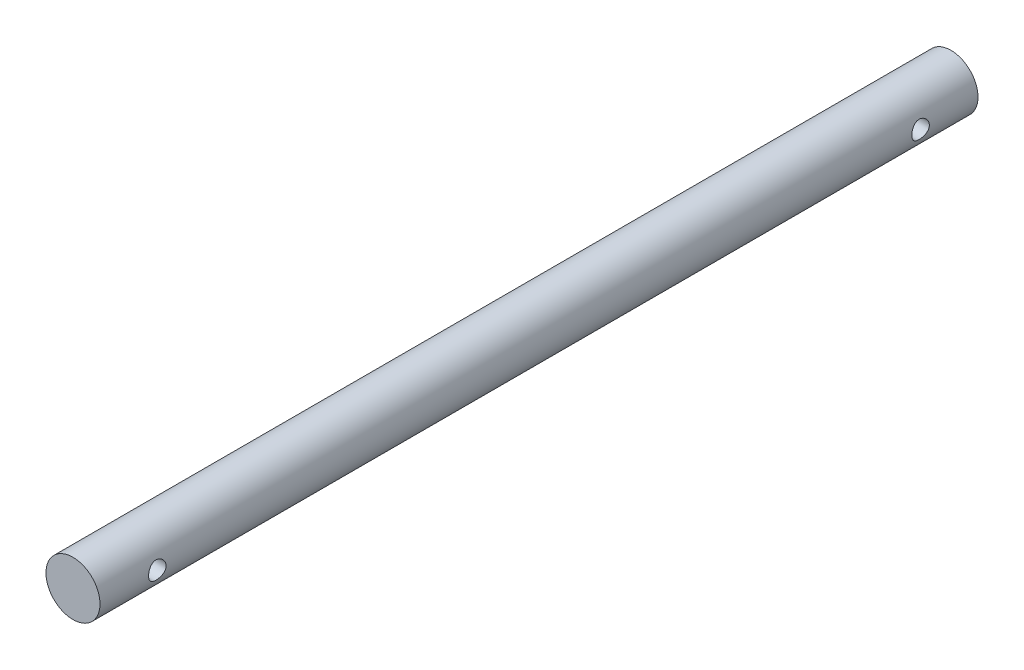
ISO-10303-21;
HEADER;
FILE_DESCRIPTION(('STEP AP214'),'2;1');
FILE_NAME('part.step','',(''),(''),'','','');
FILE_SCHEMA(('AUTOMOTIVE_DESIGN { 1 0 10303 214 1 1 1 1 }'));
ENDSEC;
DATA;
#1=APPLICATION_CONTEXT('core data for automotive mechanical design processes');
#2=APPLICATION_PROTOCOL_DEFINITION('international standard','automotive_design',2000,#1);
#3=PRODUCT_CONTEXT('',#1,'mechanical');
#4=PRODUCT('Part','Part','',(#3));
#5=PRODUCT_RELATED_PRODUCT_CATEGORY('part','',(#4));
#6=PRODUCT_DEFINITION_FORMATION('','',#4);
#7=PRODUCT_DEFINITION_CONTEXT('part definition',#1,'design');
#8=PRODUCT_DEFINITION('design','',#6,#7);
#9=PRODUCT_DEFINITION_SHAPE('','',#8);
#10=(LENGTH_UNIT() NAMED_UNIT(*) SI_UNIT(.MILLI.,.METRE.));
#11=(NAMED_UNIT(*) PLANE_ANGLE_UNIT() SI_UNIT($,.RADIAN.));
#12=(NAMED_UNIT(*) SI_UNIT($,.STERADIAN.) SOLID_ANGLE_UNIT());
#13=UNCERTAINTY_MEASURE_WITH_UNIT(LENGTH_MEASURE(1.E-05),#10,'distance_accuracy_value','');
#14=(GEOMETRIC_REPRESENTATION_CONTEXT(3) GLOBAL_UNCERTAINTY_ASSIGNED_CONTEXT((#13)) GLOBAL_UNIT_ASSIGNED_CONTEXT((#10,
#11,#12)) REPRESENTATION_CONTEXT('',''));
#15=CARTESIAN_POINT('',(0.,0.,0.));
#16=DIRECTION('',(0.,0.,1.));
#17=DIRECTION('',(1.,0.,0.));
#18=AXIS2_PLACEMENT_3D('',#15,#16,#17);
#19=CARTESIAN_POINT('',(0.,0.,65.));
#20=DIRECTION('',(0.,0.,-1.));
#21=DIRECTION('',(-1.,0.,0.));
#22=AXIS2_PLACEMENT_3D('',#19,#20,#21);
#23=CYLINDRICAL_SURFACE('',#22,4.);
#24=CARTESIAN_POINT('',(-4.,0.,-57.8));
#25=CARTESIAN_POINT('',(-3.99999995749826,0.0710317531796134,-57.7999999915574));
#26=CARTESIAN_POINT('',(-3.99809031754443,0.142064319771244,-57.7941592146114));
#27=CARTESIAN_POINT('',(-3.99066007129691,0.282043244902984,-57.7710177333086));
#28=CARTESIAN_POINT('',(-3.98513891199812,0.350989282256519,-57.7537152739045));
#29=CARTESIAN_POINT('',(-3.97108686402745,0.484756730720896,-57.7083019091299));
#30=CARTESIAN_POINT('',(-3.96256085810308,0.549584633114747,-57.6802085319232));
#31=CARTESIAN_POINT('',(-3.94337344575548,0.673609049608407,-57.6140881392865));
#32=CARTESIAN_POINT('',(-3.93271165158622,0.732804538277697,-57.5760593197244));
#33=CARTESIAN_POINT('',(-3.90998372899119,0.845844324592794,-57.489823575483));
#34=CARTESIAN_POINT('',(-3.89788518143411,0.899476148698546,-57.4413467224814));
#35=CARTESIAN_POINT('',(-3.87382947393024,0.998009376364184,-57.3361652135651));
#36=CARTESIAN_POINT('',(-3.8618723435757,1.04290898199248,-57.2794588674161));
#37=CARTESIAN_POINT('',(-3.83910022419606,1.1238912045513,-57.1575451892996));
#38=CARTESIAN_POINT('',(-3.82832495090894,1.15970201778359,-57.0921491800807));
#39=CARTESIAN_POINT('',(-3.80962732329391,1.2197275485592,-56.9558560399167));
#40=CARTESIAN_POINT('',(-3.80170414740975,1.2439456060987,-56.8849605002938));
#41=CARTESIAN_POINT('',(-3.78994824939412,1.27930904388608,-56.7420896013912));
#42=CARTESIAN_POINT('',(-3.78599180890623,1.29085096417072,-56.6702228681426));
#43=CARTESIAN_POINT('',(-3.78225082997438,1.30177383652827,-56.5254724171975));
#44=CARTESIAN_POINT('',(-3.78246507697006,1.30115832900706,-56.4525890017506));
#45=CARTESIAN_POINT('',(-3.78693252569251,1.28809262055215,-56.3112139686567));
#46=CARTESIAN_POINT('',(-3.7910110016715,1.27615436726455,-56.2426685697055));
#47=CARTESIAN_POINT('',(-3.80246229924942,1.24161512958322,-56.1086121064729));
#48=CARTESIAN_POINT('',(-3.80983549711462,1.21901292732086,-56.0431013897039));
#49=CARTESIAN_POINT('',(-3.82717376020854,1.16344161675496,-55.9157878900925));
#50=CARTESIAN_POINT('',(-3.83717725165528,1.13031715471231,-55.8540583766973));
#51=CARTESIAN_POINT('',(-3.85863224992365,1.05474946074364,-55.7368696281308));
#52=CARTESIAN_POINT('',(-3.870084157805,1.01230364537251,-55.6814121377407));
#53=CARTESIAN_POINT('',(-3.89383857895105,0.916817626217515,-55.5754576778682));
#54=CARTESIAN_POINT('',(-3.9061551456587,0.86335719555285,-55.5253418243001));
#55=CARTESIAN_POINT('',(-3.92975388043403,0.748638379559231,-55.4346899735332));
#56=CARTESIAN_POINT('',(-3.94103595880375,0.68737931912799,-55.3941548065725));
#57=CARTESIAN_POINT('',(-3.96143016559477,0.558023985184922,-55.323528167855));
#58=CARTESIAN_POINT('',(-3.97052179542748,0.489871005415787,-55.2935342325606));
#59=CARTESIAN_POINT('',(-3.98536230063387,0.349121400547621,-55.2455529803606));
#60=CARTESIAN_POINT('',(-3.99111227737589,0.27652624826376,-55.2275617072335));
#61=CARTESIAN_POINT('',(-3.99844127975227,0.132182918271081,-55.2047610758344));
#62=CARTESIAN_POINT('',(-4.00018327673697,0.0605243096610287,-55.1994363504567));
#63=CARTESIAN_POINT('',(-3.99978606047933,-0.0826739014571985,-55.2006579981489));
#64=CARTESIAN_POINT('',(-3.9976474660515,-0.154213521119022,-55.2072024785082));
#65=CARTESIAN_POINT('',(-3.98983676355579,-0.293110805971635,-55.2315664501654));
#66=CARTESIAN_POINT('',(-3.98426262217605,-0.360529313749148,-55.2490735496473));
#67=CARTESIAN_POINT('',(-3.97024137257806,-0.49144850227701,-55.2944790559484));
#68=CARTESIAN_POINT('',(-3.96179390197973,-0.554948687660263,-55.3223787735118));
#69=CARTESIAN_POINT('',(-3.94261947612255,-0.678036221921956,-55.3885709080938));
#70=CARTESIAN_POINT('',(-3.93183977717441,-0.737482077392622,-55.42711072995));
#71=CARTESIAN_POINT('',(-3.90922753070674,-0.849232602923503,-55.5131959615893));
#72=CARTESIAN_POINT('',(-3.89739467651042,-0.901535181563672,-55.5607439991268));
#73=CARTESIAN_POINT('',(-3.87336557807198,-0.999856389034448,-55.6659203912177));
#74=CARTESIAN_POINT('',(-3.86117563223107,-1.04550735590287,-55.723894696495));
#75=CARTESIAN_POINT('',(-3.83833739688013,-1.12647310324813,-55.8469444010621));
#76=CARTESIAN_POINT('',(-3.82768910353419,-1.16178790944342,-55.9120197826824));
#77=CARTESIAN_POINT('',(-3.8092505069153,-1.22088986143038,-56.0473810157582));
#78=CARTESIAN_POINT('',(-3.80145207641862,-1.24470985134209,-56.1176513521852));
#79=CARTESIAN_POINT('',(-3.78968975260594,-1.28008038267551,-56.261515112629));
#80=CARTESIAN_POINT('',(-3.78572424334592,-1.29163609486851,-56.3351071225327));
#81=CARTESIAN_POINT('',(-3.78225434748287,-1.30175941935977,-56.4796560469772));
#82=CARTESIAN_POINT('',(-3.78254135999566,-1.3009343264965,-56.550565917239));
#83=CARTESIAN_POINT('',(-3.78703206665166,-1.28780245786658,-56.6911815984667));
#84=CARTESIAN_POINT('',(-3.79123554904181,-1.27549630285018,-56.7608874743219));
#85=CARTESIAN_POINT('',(-3.80293404765169,-1.24017228292054,-56.8959328422913));
#86=CARTESIAN_POINT('',(-3.8103713796557,-1.21734173710049,-56.9613267147114));
#87=CARTESIAN_POINT('',(-3.82768086764088,-1.16176689198724,-57.0874068701794));
#88=CARTESIAN_POINT('',(-3.83755354649392,-1.12902046339815,-57.1480921386015));
#89=CARTESIAN_POINT('',(-3.85913635454559,-1.05294351879197,-57.2657824733854));
#90=CARTESIAN_POINT('',(-3.87090607008722,-1.00922756451649,-57.3225274085499));
#91=CARTESIAN_POINT('',(-3.89469754820139,-0.913114871600302,-57.4280723627933));
#92=CARTESIAN_POINT('',(-3.90671937963017,-0.860715733771488,-57.4768701786514));
#93=CARTESIAN_POINT('',(-3.93018500837504,-0.74643501926979,-57.5669187192873));
#94=CARTESIAN_POINT('',(-3.94159191016833,-0.684277994970702,-57.6078306352571));
#95=CARTESIAN_POINT('',(-3.96205639312843,-0.553600636038902,-57.6785762614709));
#96=CARTESIAN_POINT('',(-3.971114708701,-0.485082299719981,-57.7084134360625));
#97=CARTESIAN_POINT('',(-3.98539862047601,-0.347932952278429,-57.7545332143962));
#98=CARTESIAN_POINT('',(-3.99082412302041,-0.279563201389541,-57.7715309556802));
#99=CARTESIAN_POINT('',(-3.99812440031188,-0.140795566975075,-57.794262977429));
#100=CARTESIAN_POINT('',(-4.00000004212264,-0.0703981829706459,-57.8000000083673));
#101=CARTESIAN_POINT('',(-4.,0.,-57.8));
#102=B_SPLINE_CURVE_WITH_KNOTS('',3,(#24,#25,#26,#27,#28,#29,#30,#31,#32,#33,#34,#35,#36,#37,
#38,#39,#40,#41,#42,#43,#44,#45,#46,#47,#48,#49,#50,#51,#52,#53,#54,#55,#56,#57,#58,#59,#60,#61,
#62,#63,#64,#65,#66,#67,#68,#69,#70,#71,#72,#73,#74,#75,#76,#77,#78,#79,#80,#81,#82,#83,#84,#85,
#86,#87,#88,#89,#90,#91,#92,#93,#94,#95,#96,#97,#98,#99,#100,#101),.UNSPECIFIED.,.T.,.F.,(4,2,2,
2,2,2,2,2,2,2,2,2,2,2,2,2,2,2,2,2,2,2,2,2,2,2,2,2,2,2,2,2,2,2,2,2,2,2,4),(0.,0.212836320501871,
0.425705238678368,0.638229836796225,0.850793053150726,1.06970118523821,1.28865434209611,
1.51353896111274,1.73835874942418,1.95592547275084,2.17342883866662,2.38154447169366,
2.58968387817212,2.80105153146273,3.01247784012411,3.23436338576862,3.45626815240874,
3.68017522233036,3.90400845328364,4.11856594913053,4.33308923379461,4.54176144591878,
4.75045998524196,4.96449273597468,5.17858801783488,5.40190417826791,5.62521978304092,
5.84789347385934,6.0704732453528,6.28217245322978,6.49386021576158,6.7019176519715,
6.9100197973008,7.12682695905995,7.34369412543826,7.56844430375461,7.79312411742493,
8.00411357835247,8.21505149784324),.UNSPECIFIED.);
#103=CARTESIAN_POINT('',(-4.,0.,-57.8));
#104=VERTEX_POINT('',#103);
#105=EDGE_CURVE('E62',#104,#104,#102,.T.);
#106=ORIENTED_EDGE('',*,*,#105,.T.);
#107=EDGE_LOOP('',(#106));
#108=FACE_BOUND('',#107,.T.);
#109=CARTESIAN_POINT('',(4.,0.,-57.8));
#110=CARTESIAN_POINT('',(3.99999995749826,-0.0710317531796134,-57.7999999915574));
#111=CARTESIAN_POINT('',(3.99809031754443,-0.142064319771244,-57.7941592146114));
#112=CARTESIAN_POINT('',(3.99066007129691,-0.282043244902984,-57.7710177333086));
#113=CARTESIAN_POINT('',(3.98513891199812,-0.350989282256519,-57.7537152739045));
#114=CARTESIAN_POINT('',(3.97108686402745,-0.484756730720896,-57.7083019091299));
#115=CARTESIAN_POINT('',(3.96256085810308,-0.549584633114747,-57.6802085319232));
#116=CARTESIAN_POINT('',(3.94337344575548,-0.673609049608407,-57.6140881392865));
#117=CARTESIAN_POINT('',(3.93271165158622,-0.732804538277697,-57.5760593197244));
#118=CARTESIAN_POINT('',(3.90998372899119,-0.845844324592794,-57.489823575483));
#119=CARTESIAN_POINT('',(3.89788518143411,-0.899476148698546,-57.4413467224814));
#120=CARTESIAN_POINT('',(3.87382947393024,-0.998009376364184,-57.3361652135651));
#121=CARTESIAN_POINT('',(3.8618723435757,-1.04290898199248,-57.2794588674161));
#122=CARTESIAN_POINT('',(3.83910022419606,-1.1238912045513,-57.1575451892996));
#123=CARTESIAN_POINT('',(3.82832495090894,-1.15970201778359,-57.0921491800807));
#124=CARTESIAN_POINT('',(3.80962732329391,-1.2197275485592,-56.9558560399167));
#125=CARTESIAN_POINT('',(3.80170414740975,-1.2439456060987,-56.8849605002938));
#126=CARTESIAN_POINT('',(3.78994824939412,-1.27930904388608,-56.7420896013912));
#127=CARTESIAN_POINT('',(3.78599180890623,-1.29085096417072,-56.6702228681426));
#128=CARTESIAN_POINT('',(3.78225082997438,-1.30177383652827,-56.5254724171975));
#129=CARTESIAN_POINT('',(3.78246507697006,-1.30115832900706,-56.4525890017506));
#130=CARTESIAN_POINT('',(3.78693252569251,-1.28809262055215,-56.3112139686567));
#131=CARTESIAN_POINT('',(3.7910110016715,-1.27615436726455,-56.2426685697055));
#132=CARTESIAN_POINT('',(3.80246229924942,-1.24161512958322,-56.1086121064729));
#133=CARTESIAN_POINT('',(3.80983549711462,-1.21901292732086,-56.0431013897039));
#134=CARTESIAN_POINT('',(3.82717376020854,-1.16344161675496,-55.9157878900925));
#135=CARTESIAN_POINT('',(3.83717725165528,-1.13031715471231,-55.8540583766973));
#136=CARTESIAN_POINT('',(3.85863224992365,-1.05474946074364,-55.7368696281308));
#137=CARTESIAN_POINT('',(3.870084157805,-1.01230364537251,-55.6814121377407));
#138=CARTESIAN_POINT('',(3.89383857895105,-0.916817626217515,-55.5754576778682));
#139=CARTESIAN_POINT('',(3.9061551456587,-0.86335719555285,-55.5253418243001));
#140=CARTESIAN_POINT('',(3.92975388043403,-0.748638379559231,-55.4346899735332));
#141=CARTESIAN_POINT('',(3.94103595880375,-0.68737931912799,-55.3941548065725));
#142=CARTESIAN_POINT('',(3.96143016559477,-0.558023985184922,-55.323528167855));
#143=CARTESIAN_POINT('',(3.97052179542748,-0.489871005415787,-55.2935342325606));
#144=CARTESIAN_POINT('',(3.98536230063387,-0.349121400547621,-55.2455529803606));
#145=CARTESIAN_POINT('',(3.99111227737589,-0.27652624826376,-55.2275617072335));
#146=CARTESIAN_POINT('',(3.99844127975227,-0.132182918271081,-55.2047610758344));
#147=CARTESIAN_POINT('',(4.00018327673697,-0.0605243096610287,-55.1994363504567));
#148=CARTESIAN_POINT('',(3.99978606047933,0.0826739014571985,-55.2006579981489));
#149=CARTESIAN_POINT('',(3.9976474660515,0.154213521119022,-55.2072024785082));
#150=CARTESIAN_POINT('',(3.98983676355579,0.293110805971635,-55.2315664501654));
#151=CARTESIAN_POINT('',(3.98426262217605,0.360529313749148,-55.2490735496473));
#152=CARTESIAN_POINT('',(3.97024137257806,0.49144850227701,-55.2944790559484));
#153=CARTESIAN_POINT('',(3.96179390197973,0.554948687660263,-55.3223787735118));
#154=CARTESIAN_POINT('',(3.94261947612255,0.678036221921956,-55.3885709080938));
#155=CARTESIAN_POINT('',(3.93183977717441,0.737482077392622,-55.42711072995));
#156=CARTESIAN_POINT('',(3.90922753070674,0.849232602923503,-55.5131959615893));
#157=CARTESIAN_POINT('',(3.89739467651042,0.901535181563672,-55.5607439991268));
#158=CARTESIAN_POINT('',(3.87336557807198,0.999856389034448,-55.6659203912177));
#159=CARTESIAN_POINT('',(3.86117563223107,1.04550735590287,-55.723894696495));
#160=CARTESIAN_POINT('',(3.83833739688013,1.12647310324813,-55.8469444010621));
#161=CARTESIAN_POINT('',(3.82768910353419,1.16178790944342,-55.9120197826824));
#162=CARTESIAN_POINT('',(3.8092505069153,1.22088986143038,-56.0473810157582));
#163=CARTESIAN_POINT('',(3.80145207641862,1.24470985134209,-56.1176513521852));
#164=CARTESIAN_POINT('',(3.78968975260594,1.28008038267551,-56.261515112629));
#165=CARTESIAN_POINT('',(3.78572424334592,1.29163609486851,-56.3351071225327));
#166=CARTESIAN_POINT('',(3.78225434748287,1.30175941935977,-56.4796560469772));
#167=CARTESIAN_POINT('',(3.78254135999566,1.3009343264965,-56.550565917239));
#168=CARTESIAN_POINT('',(3.78703206665166,1.28780245786658,-56.6911815984667));
#169=CARTESIAN_POINT('',(3.79123554904181,1.27549630285018,-56.7608874743219));
#170=CARTESIAN_POINT('',(3.80293404765169,1.24017228292054,-56.8959328422913));
#171=CARTESIAN_POINT('',(3.8103713796557,1.21734173710049,-56.9613267147114));
#172=CARTESIAN_POINT('',(3.82768086764088,1.16176689198724,-57.0874068701794));
#173=CARTESIAN_POINT('',(3.83755354649392,1.12902046339815,-57.1480921386015));
#174=CARTESIAN_POINT('',(3.85913635454559,1.05294351879197,-57.2657824733854));
#175=CARTESIAN_POINT('',(3.87090607008722,1.00922756451649,-57.3225274085499));
#176=CARTESIAN_POINT('',(3.89469754820139,0.913114871600302,-57.4280723627933));
#177=CARTESIAN_POINT('',(3.90671937963017,0.860715733771488,-57.4768701786514));
#178=CARTESIAN_POINT('',(3.93018500837504,0.74643501926979,-57.5669187192873));
#179=CARTESIAN_POINT('',(3.94159191016833,0.684277994970702,-57.6078306352571));
#180=CARTESIAN_POINT('',(3.96205639312843,0.553600636038902,-57.6785762614709));
#181=CARTESIAN_POINT('',(3.971114708701,0.485082299719981,-57.7084134360625));
#182=CARTESIAN_POINT('',(3.98539862047601,0.347932952278429,-57.7545332143962));
#183=CARTESIAN_POINT('',(3.99082412302041,0.279563201389541,-57.7715309556802));
#184=CARTESIAN_POINT('',(3.99812440031188,0.140795566975075,-57.794262977429));
#185=CARTESIAN_POINT('',(4.00000004212264,0.0703981829706459,-57.8000000083673));
#186=CARTESIAN_POINT('',(4.,0.,-57.8));
#187=B_SPLINE_CURVE_WITH_KNOTS('',3,(#109,#110,#111,#112,#113,#114,#115,#116,#117,#118,#119,
#120,#121,#122,#123,#124,#125,#126,#127,#128,#129,#130,#131,#132,#133,#134,#135,#136,#137,#138,
#139,#140,#141,#142,#143,#144,#145,#146,#147,#148,#149,#150,#151,#152,#153,#154,#155,#156,#157,
#158,#159,#160,#161,#162,#163,#164,#165,#166,#167,#168,#169,#170,#171,#172,#173,#174,#175,#176,
#177,#178,#179,#180,#181,#182,#183,#184,#185,#186),.UNSPECIFIED.,.T.,.F.,(4,2,2,2,2,2,2,2,2,2,2,
2,2,2,2,2,2,2,2,2,2,2,2,2,2,2,2,2,2,2,2,2,2,2,2,2,2,2,4),(0.,0.212836320501871,
0.425705238678368,0.638229836796225,0.850793053150726,1.06970118523821,1.28865434209611,
1.51353896111274,1.73835874942418,1.95592547275084,2.17342883866662,2.38154447169366,
2.58968387817212,2.80105153146273,3.01247784012411,3.23436338576862,3.45626815240874,
3.68017522233036,3.90400845328364,4.11856594913053,4.33308923379461,4.54176144591878,
4.75045998524196,4.96449273597468,5.17858801783488,5.40190417826791,5.62521978304092,
5.84789347385934,6.0704732453528,6.28217245322978,6.49386021576158,6.7019176519715,
6.9100197973008,7.12682695905995,7.34369412543826,7.56844430375461,7.79312411742493,
8.00411357835247,8.21505149784324),.UNSPECIFIED.);
#188=CARTESIAN_POINT('',(4.,0.,-57.8));
#189=VERTEX_POINT('',#188);
#190=EDGE_CURVE('E67',#189,#189,#187,.T.);
#191=ORIENTED_EDGE('',*,*,#190,.T.);
#192=EDGE_LOOP('',(#191));
#193=FACE_BOUND('',#192,.T.);
#194=CARTESIAN_POINT('',(0.,0.,65.));
#195=DIRECTION('',(0.,0.,1.));
#196=DIRECTION('',(1.,0.,0.));
#197=AXIS2_PLACEMENT_3D('',#194,#195,#196);
#198=CIRCLE('',#197,4.);
#199=CARTESIAN_POINT('',(4.,0.,65.));
#200=VERTEX_POINT('',#199);
#201=EDGE_CURVE('E95',#200,#200,#198,.T.);
#202=ORIENTED_EDGE('',*,*,#201,.F.);
#203=EDGE_LOOP('',(#202));
#204=FACE_BOUND('',#203,.T.);
#205=CARTESIAN_POINT('',(0.,0.,-65.));
#206=DIRECTION('',(0.,0.,1.));
#207=DIRECTION('',(1.,0.,0.));
#208=AXIS2_PLACEMENT_3D('',#205,#206,#207);
#209=CIRCLE('',#208,4.);
#210=CARTESIAN_POINT('',(4.,0.,-65.));
#211=VERTEX_POINT('',#210);
#212=EDGE_CURVE('E96',#211,#211,#209,.T.);
#213=ORIENTED_EDGE('',*,*,#212,.T.);
#214=EDGE_LOOP('',(#213));
#215=FACE_BOUND('',#214,.T.);
#216=CARTESIAN_POINT('',(4.,0.,55.2));
#217=CARTESIAN_POINT('',(3.99999995749826,0.0710317531796133,55.2000000084426));
#218=CARTESIAN_POINT('',(3.99809031754443,0.142064319771243,55.2058407853886));
#219=CARTESIAN_POINT('',(3.99066007129691,0.282043244902984,55.2289822666914));
#220=CARTESIAN_POINT('',(3.98513891199812,0.350989282256519,55.2462847260955));
#221=CARTESIAN_POINT('',(3.97108686402745,0.484756730720893,55.2916980908701));
#222=CARTESIAN_POINT('',(3.96256085810308,0.549584633114741,55.3197914680768));
#223=CARTESIAN_POINT('',(3.94337344575548,0.673609049608401,55.3859118607135));
#224=CARTESIAN_POINT('',(3.93271165158623,0.732804538277695,55.4239406802756));
#225=CARTESIAN_POINT('',(3.90998372899119,0.845844324592795,55.510176424517));
#226=CARTESIAN_POINT('',(3.89788518143411,0.899476148698546,55.5586532775186));
#227=CARTESIAN_POINT('',(3.87382947393024,0.998009376364184,55.6638347864349));
#228=CARTESIAN_POINT('',(3.8618723435757,1.04290898199248,55.7205411325839));
#229=CARTESIAN_POINT('',(3.83910022419606,1.1238912045513,55.8424548107004));
#230=CARTESIAN_POINT('',(3.82832495090894,1.15970201778359,55.9078508199193));
#231=CARTESIAN_POINT('',(3.80962732329391,1.2197275485592,56.0441439600833));
#232=CARTESIAN_POINT('',(3.80170414740975,1.2439456060987,56.1150394997062));
#233=CARTESIAN_POINT('',(3.78994824939412,1.27930904388608,56.2579103986088));
#234=CARTESIAN_POINT('',(3.78599180890623,1.29085096417072,56.3297771318573));
#235=CARTESIAN_POINT('',(3.78225082997438,1.30177383652827,56.4745275828025));
#236=CARTESIAN_POINT('',(3.78246507697006,1.30115832900706,56.5474109982494));
#237=CARTESIAN_POINT('',(3.78693252569251,1.28809262055215,56.6887860313433));
#238=CARTESIAN_POINT('',(3.7910110016715,1.27615436726456,56.7573314302945));
#239=CARTESIAN_POINT('',(3.80246229924942,1.24161512958323,56.8913878935271));
#240=CARTESIAN_POINT('',(3.80983549711462,1.21901292732087,56.9568986102961));
#241=CARTESIAN_POINT('',(3.82717376020853,1.16344161675496,57.0842121099075));
#242=CARTESIAN_POINT('',(3.83717725165528,1.13031715471231,57.1459416233027));
#243=CARTESIAN_POINT('',(3.85863224992365,1.05474946074364,57.2631303718691));
#244=CARTESIAN_POINT('',(3.870084157805,1.01230364537251,57.3185878622593));
#245=CARTESIAN_POINT('',(3.89383857895105,0.916817626217515,57.4245423221318));
#246=CARTESIAN_POINT('',(3.9061551456587,0.86335719555285,57.4746581756999));
#247=CARTESIAN_POINT('',(3.92975388043403,0.748638379559231,57.5653100264668));
#248=CARTESIAN_POINT('',(3.94103595880375,0.687379319127989,57.6058451934275));
#249=CARTESIAN_POINT('',(3.96143016559477,0.558023985184922,57.676471832145));
#250=CARTESIAN_POINT('',(3.97052179542748,0.489871005415787,57.7064657674394));
#251=CARTESIAN_POINT('',(3.98536230063387,0.349121400547621,57.7544470196394));
#252=CARTESIAN_POINT('',(3.99111227737589,0.27652624826376,57.7724382927666));
#253=CARTESIAN_POINT('',(3.99844127975227,0.132182918271081,57.7952389241656));
#254=CARTESIAN_POINT('',(4.00018327673697,0.0605243096610287,57.8005636495433));
#255=CARTESIAN_POINT('',(3.99978606047933,-0.0826739014571985,57.7993420018511));
#256=CARTESIAN_POINT('',(3.9976474660515,-0.154213521119022,57.7927975214918));
#257=CARTESIAN_POINT('',(3.98983676355579,-0.293110805971635,57.7684335498346));
#258=CARTESIAN_POINT('',(3.98426262217605,-0.360529313749148,57.7509264503527));
#259=CARTESIAN_POINT('',(3.97024137257806,-0.49144850227701,57.7055209440516));
#260=CARTESIAN_POINT('',(3.96179390197973,-0.554948687660263,57.6776212264882));
#261=CARTESIAN_POINT('',(3.94261947612255,-0.678036221921956,57.6114290919062));
#262=CARTESIAN_POINT('',(3.93183977717441,-0.737482077392622,57.57288927005));
#263=CARTESIAN_POINT('',(3.90922753070674,-0.849232602923503,57.4868040384107));
#264=CARTESIAN_POINT('',(3.89739467651042,-0.901535181563672,57.4392560008732));
#265=CARTESIAN_POINT('',(3.87336557807198,-0.999856389034449,57.3340796087823));
#266=CARTESIAN_POINT('',(3.86117563223107,-1.04550735590287,57.276105303505));
#267=CARTESIAN_POINT('',(3.83833739688013,-1.12647310324813,57.1530555989379));
#268=CARTESIAN_POINT('',(3.82768910353419,-1.16178790944342,57.0879802173176));
#269=CARTESIAN_POINT('',(3.8092505069153,-1.22088986143038,56.9526189842418));
#270=CARTESIAN_POINT('',(3.80145207641862,-1.24470985134209,56.8823486478148));
#271=CARTESIAN_POINT('',(3.78968975260594,-1.28008038267551,56.738484887371));
#272=CARTESIAN_POINT('',(3.78572424334592,-1.29163609486851,56.6648928774673));
#273=CARTESIAN_POINT('',(3.78225434748287,-1.30175941935977,56.5203439530228));
#274=CARTESIAN_POINT('',(3.78254135999566,-1.3009343264965,56.449434082761));
#275=CARTESIAN_POINT('',(3.78703206665166,-1.28780245786658,56.3088184015333));
#276=CARTESIAN_POINT('',(3.79123554904181,-1.27549630285018,56.2391125256781));
#277=CARTESIAN_POINT('',(3.80293404765169,-1.24017228292054,56.1040671577087));
#278=CARTESIAN_POINT('',(3.8103713796557,-1.21734173710049,56.0386732852886));
#279=CARTESIAN_POINT('',(3.82768086764088,-1.16176689198724,55.9125931298206));
#280=CARTESIAN_POINT('',(3.83755354649392,-1.12902046339815,55.8519078613985));
#281=CARTESIAN_POINT('',(3.85913635454559,-1.05294351879197,55.7342175266146));
#282=CARTESIAN_POINT('',(3.87090607008722,-1.00922756451649,55.6774725914501));
#283=CARTESIAN_POINT('',(3.89469754820139,-0.913114871600302,55.5719276372067));
#284=CARTESIAN_POINT('',(3.90671937963017,-0.860715733771488,55.5231298213486));
#285=CARTESIAN_POINT('',(3.93018500837504,-0.74643501926979,55.4330812807127));
#286=CARTESIAN_POINT('',(3.94159191016833,-0.684277994970702,55.3921693647429));
#287=CARTESIAN_POINT('',(3.96205639312843,-0.553600636038902,55.3214237385291));
#288=CARTESIAN_POINT('',(3.971114708701,-0.485082299719981,55.2915865639375));
#289=CARTESIAN_POINT('',(3.98539862047601,-0.347932952278429,55.2454667856038));
#290=CARTESIAN_POINT('',(3.99082412302041,-0.279563201389541,55.2284690443198));
#291=CARTESIAN_POINT('',(3.99812440031188,-0.140795566975075,55.205737022571));
#292=CARTESIAN_POINT('',(4.00000004212264,-0.0703981829706459,55.1999999916327));
#293=CARTESIAN_POINT('',(4.,0.,55.2));
#294=B_SPLINE_CURVE_WITH_KNOTS('',3,(#216,#217,#218,#219,#220,#221,#222,#223,#224,#225,#226,
#227,#228,#229,#230,#231,#232,#233,#234,#235,#236,#237,#238,#239,#240,#241,#242,#243,#244,#245,
#246,#247,#248,#249,#250,#251,#252,#253,#254,#255,#256,#257,#258,#259,#260,#261,#262,#263,#264,
#265,#266,#267,#268,#269,#270,#271,#272,#273,#274,#275,#276,#277,#278,#279,#280,#281,#282,#283,
#284,#285,#286,#287,#288,#289,#290,#291,#292,#293),.UNSPECIFIED.,.T.,.F.,(4,2,2,2,2,2,2,2,2,2,2,
2,2,2,2,2,2,2,2,2,2,2,2,2,2,2,2,2,2,2,2,2,2,2,2,2,2,2,4),(0.,0.212836320501871,
0.425705238678368,0.638229836796217,0.850793053150725,1.06970118523821,1.28865434209611,
1.51353896111274,1.73835874942418,1.95592547275083,2.17342883866662,2.38154447169364,
2.58968387817212,2.80105153146272,3.01247784012411,3.23436338576861,3.45626815240874,
3.68017522233036,3.90400845328364,4.11856594913053,4.33308923379461,4.54176144591877,
4.75045998524196,4.96449273597468,5.17858801783488,5.40190417826792,5.62521978304092,
5.84789347385933,6.0704732453528,6.28217245322977,6.49386021576158,6.70191765197149,
6.9100197973008,7.12682695905995,7.34369412543825,7.5684443037546,7.79312411742493,
8.00411357835247,8.21505149784324),.UNSPECIFIED.);
#295=CARTESIAN_POINT('',(4.,0.,55.2));
#296=VERTEX_POINT('',#295);
#297=EDGE_CURVE('E57',#296,#296,#294,.T.);
#298=ORIENTED_EDGE('',*,*,#297,.F.);
#299=EDGE_LOOP('',(#298));
#300=FACE_BOUND('',#299,.T.);
#301=CARTESIAN_POINT('',(-4.,0.,55.2));
#302=CARTESIAN_POINT('',(-3.99999995749826,-0.0710317531796133,55.2000000084426));
#303=CARTESIAN_POINT('',(-3.99809031754443,-0.142064319771243,55.2058407853886));
#304=CARTESIAN_POINT('',(-3.99066007129691,-0.282043244902984,55.2289822666914));
#305=CARTESIAN_POINT('',(-3.98513891199812,-0.350989282256519,55.2462847260955));
#306=CARTESIAN_POINT('',(-3.97108686402745,-0.484756730720893,55.2916980908701));
#307=CARTESIAN_POINT('',(-3.96256085810308,-0.549584633114741,55.3197914680768));
#308=CARTESIAN_POINT('',(-3.94337344575548,-0.673609049608401,55.3859118607135));
#309=CARTESIAN_POINT('',(-3.93271165158623,-0.732804538277695,55.4239406802756));
#310=CARTESIAN_POINT('',(-3.90998372899119,-0.845844324592795,55.510176424517));
#311=CARTESIAN_POINT('',(-3.89788518143411,-0.899476148698546,55.5586532775186));
#312=CARTESIAN_POINT('',(-3.87382947393024,-0.998009376364184,55.6638347864349));
#313=CARTESIAN_POINT('',(-3.8618723435757,-1.04290898199248,55.7205411325839));
#314=CARTESIAN_POINT('',(-3.83910022419606,-1.1238912045513,55.8424548107004));
#315=CARTESIAN_POINT('',(-3.82832495090894,-1.15970201778359,55.9078508199193));
#316=CARTESIAN_POINT('',(-3.80962732329391,-1.2197275485592,56.0441439600833));
#317=CARTESIAN_POINT('',(-3.80170414740975,-1.2439456060987,56.1150394997062));
#318=CARTESIAN_POINT('',(-3.78994824939412,-1.27930904388608,56.2579103986088));
#319=CARTESIAN_POINT('',(-3.78599180890623,-1.29085096417072,56.3297771318573));
#320=CARTESIAN_POINT('',(-3.78225082997438,-1.30177383652827,56.4745275828025));
#321=CARTESIAN_POINT('',(-3.78246507697006,-1.30115832900706,56.5474109982494));
#322=CARTESIAN_POINT('',(-3.78693252569251,-1.28809262055215,56.6887860313433));
#323=CARTESIAN_POINT('',(-3.7910110016715,-1.27615436726456,56.7573314302945));
#324=CARTESIAN_POINT('',(-3.80246229924942,-1.24161512958323,56.8913878935271));
#325=CARTESIAN_POINT('',(-3.80983549711462,-1.21901292732087,56.9568986102961));
#326=CARTESIAN_POINT('',(-3.82717376020853,-1.16344161675496,57.0842121099075));
#327=CARTESIAN_POINT('',(-3.83717725165528,-1.13031715471231,57.1459416233027));
#328=CARTESIAN_POINT('',(-3.85863224992365,-1.05474946074364,57.2631303718691));
#329=CARTESIAN_POINT('',(-3.870084157805,-1.01230364537251,57.3185878622593));
#330=CARTESIAN_POINT('',(-3.89383857895105,-0.916817626217515,57.4245423221318));
#331=CARTESIAN_POINT('',(-3.9061551456587,-0.86335719555285,57.4746581756999));
#332=CARTESIAN_POINT('',(-3.92975388043403,-0.748638379559231,57.5653100264668));
#333=CARTESIAN_POINT('',(-3.94103595880375,-0.687379319127989,57.6058451934275));
#334=CARTESIAN_POINT('',(-3.96143016559477,-0.558023985184922,57.676471832145));
#335=CARTESIAN_POINT('',(-3.97052179542748,-0.489871005415787,57.7064657674394));
#336=CARTESIAN_POINT('',(-3.98536230063387,-0.349121400547621,57.7544470196394));
#337=CARTESIAN_POINT('',(-3.99111227737589,-0.27652624826376,57.7724382927666));
#338=CARTESIAN_POINT('',(-3.99844127975227,-0.132182918271081,57.7952389241656));
#339=CARTESIAN_POINT('',(-4.00018327673697,-0.0605243096610287,57.8005636495433));
#340=CARTESIAN_POINT('',(-3.99978606047933,0.0826739014571985,57.7993420018511));
#341=CARTESIAN_POINT('',(-3.9976474660515,0.154213521119022,57.7927975214918));
#342=CARTESIAN_POINT('',(-3.98983676355579,0.293110805971635,57.7684335498346));
#343=CARTESIAN_POINT('',(-3.98426262217605,0.360529313749148,57.7509264503527));
#344=CARTESIAN_POINT('',(-3.97024137257806,0.49144850227701,57.7055209440516));
#345=CARTESIAN_POINT('',(-3.96179390197973,0.554948687660263,57.6776212264882));
#346=CARTESIAN_POINT('',(-3.94261947612255,0.678036221921956,57.6114290919062));
#347=CARTESIAN_POINT('',(-3.93183977717441,0.737482077392622,57.57288927005));
#348=CARTESIAN_POINT('',(-3.90922753070674,0.849232602923503,57.4868040384107));
#349=CARTESIAN_POINT('',(-3.89739467651042,0.901535181563672,57.4392560008732));
#350=CARTESIAN_POINT('',(-3.87336557807198,0.999856389034449,57.3340796087823));
#351=CARTESIAN_POINT('',(-3.86117563223107,1.04550735590287,57.276105303505));
#352=CARTESIAN_POINT('',(-3.83833739688013,1.12647310324813,57.1530555989379));
#353=CARTESIAN_POINT('',(-3.82768910353419,1.16178790944342,57.0879802173176));
#354=CARTESIAN_POINT('',(-3.8092505069153,1.22088986143038,56.9526189842418));
#355=CARTESIAN_POINT('',(-3.80145207641862,1.24470985134209,56.8823486478148));
#356=CARTESIAN_POINT('',(-3.78968975260594,1.28008038267551,56.738484887371));
#357=CARTESIAN_POINT('',(-3.78572424334592,1.29163609486851,56.6648928774673));
#358=CARTESIAN_POINT('',(-3.78225434748287,1.30175941935977,56.5203439530228));
#359=CARTESIAN_POINT('',(-3.78254135999566,1.3009343264965,56.449434082761));
#360=CARTESIAN_POINT('',(-3.78703206665166,1.28780245786658,56.3088184015333));
#361=CARTESIAN_POINT('',(-3.79123554904181,1.27549630285018,56.2391125256781));
#362=CARTESIAN_POINT('',(-3.80293404765169,1.24017228292054,56.1040671577087));
#363=CARTESIAN_POINT('',(-3.8103713796557,1.21734173710049,56.0386732852886));
#364=CARTESIAN_POINT('',(-3.82768086764088,1.16176689198724,55.9125931298206));
#365=CARTESIAN_POINT('',(-3.83755354649392,1.12902046339815,55.8519078613985));
#366=CARTESIAN_POINT('',(-3.85913635454559,1.05294351879197,55.7342175266146));
#367=CARTESIAN_POINT('',(-3.87090607008722,1.00922756451649,55.6774725914501));
#368=CARTESIAN_POINT('',(-3.89469754820139,0.913114871600302,55.5719276372067));
#369=CARTESIAN_POINT('',(-3.90671937963017,0.860715733771488,55.5231298213486));
#370=CARTESIAN_POINT('',(-3.93018500837504,0.74643501926979,55.4330812807127));
#371=CARTESIAN_POINT('',(-3.94159191016833,0.684277994970702,55.3921693647429));
#372=CARTESIAN_POINT('',(-3.96205639312843,0.553600636038902,55.3214237385291));
#373=CARTESIAN_POINT('',(-3.971114708701,0.485082299719981,55.2915865639375));
#374=CARTESIAN_POINT('',(-3.98539862047601,0.347932952278429,55.2454667856038));
#375=CARTESIAN_POINT('',(-3.99082412302041,0.279563201389541,55.2284690443198));
#376=CARTESIAN_POINT('',(-3.99812440031188,0.140795566975075,55.205737022571));
#377=CARTESIAN_POINT('',(-4.00000004212264,0.0703981829706459,55.1999999916327));
#378=CARTESIAN_POINT('',(-4.,0.,55.2));
#379=B_SPLINE_CURVE_WITH_KNOTS('',3,(#301,#302,#303,#304,#305,#306,#307,#308,#309,#310,#311,
#312,#313,#314,#315,#316,#317,#318,#319,#320,#321,#322,#323,#324,#325,#326,#327,#328,#329,#330,
#331,#332,#333,#334,#335,#336,#337,#338,#339,#340,#341,#342,#343,#344,#345,#346,#347,#348,#349,
#350,#351,#352,#353,#354,#355,#356,#357,#358,#359,#360,#361,#362,#363,#364,#365,#366,#367,#368,
#369,#370,#371,#372,#373,#374,#375,#376,#377,#378),.UNSPECIFIED.,.T.,.F.,(4,2,2,2,2,2,2,2,2,2,2,
2,2,2,2,2,2,2,2,2,2,2,2,2,2,2,2,2,2,2,2,2,2,2,2,2,2,2,4),(0.,0.212836320501871,
0.425705238678368,0.638229836796217,0.850793053150725,1.06970118523821,1.28865434209611,
1.51353896111274,1.73835874942418,1.95592547275083,2.17342883866662,2.38154447169364,
2.58968387817212,2.80105153146272,3.01247784012411,3.23436338576861,3.45626815240874,
3.68017522233036,3.90400845328364,4.11856594913053,4.33308923379461,4.54176144591877,
4.75045998524196,4.96449273597468,5.17858801783488,5.40190417826792,5.62521978304092,
5.84789347385933,6.0704732453528,6.28217245322977,6.49386021576158,6.70191765197149,
6.9100197973008,7.12682695905995,7.34369412543825,7.5684443037546,7.79312411742493,
8.00411357835247,8.21505149784324),.UNSPECIFIED.);
#380=CARTESIAN_POINT('',(-4.,0.,55.2));
#381=VERTEX_POINT('',#380);
#382=EDGE_CURVE('E10',#381,#381,#379,.T.);
#383=ORIENTED_EDGE('',*,*,#382,.F.);
#384=EDGE_LOOP('',(#383));
#385=FACE_BOUND('',#384,.T.);
#386=ADVANCED_FACE('F45',(#108,#193,#204,#215,#300,#385),#23,.T.);
#387=CARTESIAN_POINT('',(0.,0.,65.));
#388=DIRECTION('',(0.,0.,1.));
#389=DIRECTION('',(1.,0.,0.));
#390=AXIS2_PLACEMENT_3D('',#387,#388,#389);
#391=PLANE('',#390);
#392=ORIENTED_EDGE('',*,*,#201,.T.);
#393=EDGE_LOOP('',(#392));
#394=FACE_BOUND('',#393,.T.);
#395=ADVANCED_FACE('F87',(#394),#391,.T.);
#396=CARTESIAN_POINT('',(0.,0.,-65.));
#397=DIRECTION('',(0.,0.,1.));
#398=DIRECTION('',(1.,0.,0.));
#399=AXIS2_PLACEMENT_3D('',#396,#397,#398);
#400=PLANE('',#399);
#401=ORIENTED_EDGE('',*,*,#212,.F.);
#402=EDGE_LOOP('',(#401));
#403=FACE_BOUND('',#402,.T.);
#404=ADVANCED_FACE('F85',(#403),#400,.F.);
#405=CARTESIAN_POINT('',(-4.,0.,-56.5));
#406=DIRECTION('',(1.,0.,0.));
#407=DIRECTION('',(0.,0.,-1.));
#408=AXIS2_PLACEMENT_3D('',#405,#406,#407);
#409=CYLINDRICAL_SURFACE('',#408,1.3);
#410=ORIENTED_EDGE('',*,*,#190,.F.);
#411=EDGE_LOOP('',(#410));
#412=FACE_BOUND('',#411,.T.);
#413=ORIENTED_EDGE('',*,*,#105,.F.);
#414=EDGE_LOOP('',(#413));
#415=FACE_BOUND('',#414,.T.);
#416=ADVANCED_FACE('F80',(#412,#415),#409,.F.);
#417=CARTESIAN_POINT('',(-4.,0.,56.5));
#418=DIRECTION('',(1.,0.,0.));
#419=DIRECTION('',(0.,0.,-1.));
#420=AXIS2_PLACEMENT_3D('',#417,#418,#419);
#421=CYLINDRICAL_SURFACE('',#420,1.3);
#422=ORIENTED_EDGE('',*,*,#297,.T.);
#423=EDGE_LOOP('',(#422));
#424=FACE_BOUND('',#423,.T.);
#425=ORIENTED_EDGE('',*,*,#382,.T.);
#426=EDGE_LOOP('',(#425));
#427=FACE_BOUND('',#426,.T.);
#428=ADVANCED_FACE('F77',(#424,#427),#421,.F.);
#429=CLOSED_SHELL('',(#386,#395,#404,#416,#428));
#430=MANIFOLD_SOLID_BREP('B2',#429);
#431=ADVANCED_BREP_SHAPE_REPRESENTATION('',(#18,#430),#14);
#432=SHAPE_DEFINITION_REPRESENTATION(#9,#431);
ENDSEC;
END-ISO-10303-21;
